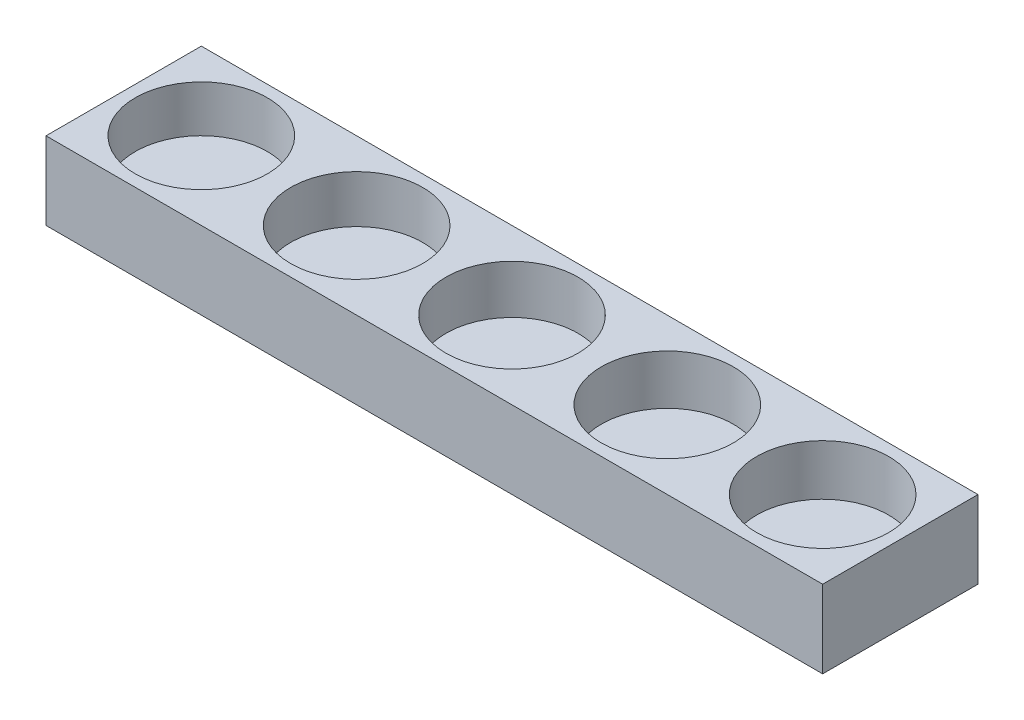
ISO-10303-21;
HEADER;
FILE_DESCRIPTION(('STEP AP214'),'2;1');
FILE_NAME('part.step','',(''),(''),'','','');
FILE_SCHEMA(('AUTOMOTIVE_DESIGN { 1 0 10303 214 1 1 1 1 }'));
ENDSEC;
DATA;
#1=APPLICATION_CONTEXT('core data for automotive mechanical design processes');
#2=APPLICATION_PROTOCOL_DEFINITION('international standard','automotive_design',2000,#1);
#3=PRODUCT_CONTEXT('',#1,'mechanical');
#4=PRODUCT('Part','Part','',(#3));
#5=PRODUCT_RELATED_PRODUCT_CATEGORY('part','',(#4));
#6=PRODUCT_DEFINITION_FORMATION('','',#4);
#7=PRODUCT_DEFINITION_CONTEXT('part definition',#1,'design');
#8=PRODUCT_DEFINITION('design','',#6,#7);
#9=PRODUCT_DEFINITION_SHAPE('','',#8);
#10=(LENGTH_UNIT() NAMED_UNIT(*) SI_UNIT(.MILLI.,.METRE.));
#11=(NAMED_UNIT(*) PLANE_ANGLE_UNIT() SI_UNIT($,.RADIAN.));
#12=(NAMED_UNIT(*) SI_UNIT($,.STERADIAN.) SOLID_ANGLE_UNIT());
#13=UNCERTAINTY_MEASURE_WITH_UNIT(LENGTH_MEASURE(1.E-05),#10,'distance_accuracy_value','');
#14=(GEOMETRIC_REPRESENTATION_CONTEXT(3) GLOBAL_UNCERTAINTY_ASSIGNED_CONTEXT((#13)) GLOBAL_UNIT_ASSIGNED_CONTEXT((#10,
#11,#12)) REPRESENTATION_CONTEXT('',''));
#15=CARTESIAN_POINT('',(0.,0.,0.));
#16=DIRECTION('',(0.,0.,1.));
#17=DIRECTION('',(1.,0.,0.));
#18=AXIS2_PLACEMENT_3D('',#15,#16,#17);
#19=CARTESIAN_POINT('',(0.,0.,0.));
#20=DIRECTION('',(0.,1.,0.));
#21=DIRECTION('',(0.,0.,1.));
#22=AXIS2_PLACEMENT_3D('',#19,#20,#21);
#23=PLANE('',#22);
#24=DIRECTION('',(0.,0.,1.));
#25=VECTOR('',#24,1.);
#26=CARTESIAN_POINT('',(-75.,0.,15.));
#27=LINE('',#26,#25);
#28=CARTESIAN_POINT('',(-75.,0.,-15.));
#29=VERTEX_POINT('',#28);
#30=CARTESIAN_POINT('',(-75.,0.,15.));
#31=VERTEX_POINT('',#30);
#32=EDGE_CURVE('E85',#29,#31,#27,.T.);
#33=ORIENTED_EDGE('',*,*,#32,.F.);
#34=DIRECTION('',(-1.,0.,0.));
#35=VECTOR('',#34,1.);
#36=CARTESIAN_POINT('',(75.,0.,-15.));
#37=LINE('',#36,#35);
#38=CARTESIAN_POINT('',(75.,0.,-15.));
#39=VERTEX_POINT('',#38);
#40=EDGE_CURVE('E54',#39,#29,#37,.T.);
#41=ORIENTED_EDGE('',*,*,#40,.F.);
#42=DIRECTION('',(0.,0.,-1.));
#43=VECTOR('',#42,1.);
#44=CARTESIAN_POINT('',(75.,0.,15.));
#45=LINE('',#44,#43);
#46=CARTESIAN_POINT('',(75.,0.,15.));
#47=VERTEX_POINT('',#46);
#48=EDGE_CURVE('E62',#47,#39,#45,.T.);
#49=ORIENTED_EDGE('',*,*,#48,.F.);
#50=DIRECTION('',(1.,0.,0.));
#51=VECTOR('',#50,1.);
#52=CARTESIAN_POINT('',(75.,0.,15.));
#53=LINE('',#52,#51);
#54=EDGE_CURVE('E139',#31,#47,#53,.T.);
#55=ORIENTED_EDGE('',*,*,#54,.F.);
#56=EDGE_LOOP('',(#33,#41,#49,#55));
#57=FACE_BOUND('',#56,.T.);
#58=CARTESIAN_POINT('',(-60.,0.,0.));
#59=DIRECTION('',(0.,1.,0.));
#60=DIRECTION('',(0.,0.,1.));
#61=AXIS2_PLACEMENT_3D('',#58,#59,#60);
#62=CIRCLE('',#61,5.);
#63=CARTESIAN_POINT('',(-60.,0.,5.00000000000001));
#64=VERTEX_POINT('',#63);
#65=EDGE_CURVE('E133',#64,#64,#62,.T.);
#66=ORIENTED_EDGE('',*,*,#65,.T.);
#67=EDGE_LOOP('',(#66));
#68=FACE_BOUND('',#67,.T.);
#69=CARTESIAN_POINT('',(-30.,0.,0.));
#70=DIRECTION('',(0.,1.,0.));
#71=DIRECTION('',(0.,0.,1.));
#72=AXIS2_PLACEMENT_3D('',#69,#70,#71);
#73=CIRCLE('',#72,5.);
#74=CARTESIAN_POINT('',(-30.,0.,5.00000000000001));
#75=VERTEX_POINT('',#74);
#76=EDGE_CURVE('E128',#75,#75,#73,.T.);
#77=ORIENTED_EDGE('',*,*,#76,.T.);
#78=EDGE_LOOP('',(#77));
#79=FACE_BOUND('',#78,.T.);
#80=CARTESIAN_POINT('',(0.,0.,0.));
#81=DIRECTION('',(0.,1.,0.));
#82=DIRECTION('',(0.,0.,1.));
#83=AXIS2_PLACEMENT_3D('',#80,#81,#82);
#84=CIRCLE('',#83,5.);
#85=CARTESIAN_POINT('',(0.,0.,5.00000000000001));
#86=VERTEX_POINT('',#85);
#87=EDGE_CURVE('E122',#86,#86,#84,.T.);
#88=ORIENTED_EDGE('',*,*,#87,.T.);
#89=EDGE_LOOP('',(#88));
#90=FACE_BOUND('',#89,.T.);
#91=CARTESIAN_POINT('',(30.,0.,0.));
#92=DIRECTION('',(0.,1.,0.));
#93=DIRECTION('',(0.,0.,1.));
#94=AXIS2_PLACEMENT_3D('',#91,#92,#93);
#95=CIRCLE('',#94,5.);
#96=CARTESIAN_POINT('',(30.,0.,5.00000000000001));
#97=VERTEX_POINT('',#96);
#98=EDGE_CURVE('E115',#97,#97,#95,.T.);
#99=ORIENTED_EDGE('',*,*,#98,.T.);
#100=EDGE_LOOP('',(#99));
#101=FACE_BOUND('',#100,.T.);
#102=CARTESIAN_POINT('',(60.,0.,0.));
#103=DIRECTION('',(0.,1.,0.));
#104=DIRECTION('',(0.,0.,1.));
#105=AXIS2_PLACEMENT_3D('',#102,#103,#104);
#106=CIRCLE('',#105,4.99999999999999);
#107=CARTESIAN_POINT('',(60.,0.,5.));
#108=VERTEX_POINT('',#107);
#109=EDGE_CURVE('E112',#108,#108,#106,.T.);
#110=ORIENTED_EDGE('',*,*,#109,.T.);
#111=EDGE_LOOP('',(#110));
#112=FACE_BOUND('',#111,.T.);
#113=ADVANCED_FACE('F39',(#57,#68,#79,#90,#101,#112),#23,.F.);
#114=CARTESIAN_POINT('',(-75.,5.,15.));
#115=DIRECTION('',(1.,0.,0.));
#116=DIRECTION('',(0.,0.,-1.));
#117=AXIS2_PLACEMENT_3D('',#114,#115,#116);
#118=PLANE('',#117);
#119=ORIENTED_EDGE('',*,*,#32,.T.);
#120=DIRECTION('',(0.,-1.,0.));
#121=VECTOR('',#120,1.);
#122=CARTESIAN_POINT('',(-75.,5.,15.));
#123=LINE('',#122,#121);
#124=CARTESIAN_POINT('',(-75.,15.,15.));
#125=VERTEX_POINT('',#124);
#126=EDGE_CURVE('E12',#125,#31,#123,.T.);
#127=ORIENTED_EDGE('',*,*,#126,.F.);
#128=DIRECTION('',(0.,0.,1.));
#129=VECTOR('',#128,1.);
#130=CARTESIAN_POINT('',(-75.,15.,-15.));
#131=LINE('',#130,#129);
#132=CARTESIAN_POINT('',(-75.,15.,-15.));
#133=VERTEX_POINT('',#132);
#134=EDGE_CURVE('E83',#133,#125,#131,.T.);
#135=ORIENTED_EDGE('',*,*,#134,.F.);
#136=DIRECTION('',(0.,-1.,0.));
#137=VECTOR('',#136,1.);
#138=CARTESIAN_POINT('',(-75.,5.,-15.));
#139=LINE('',#138,#137);
#140=EDGE_CURVE('E143',#133,#29,#139,.T.);
#141=ORIENTED_EDGE('',*,*,#140,.T.);
#142=EDGE_LOOP('',(#119,#127,#135,#141));
#143=FACE_BOUND('',#142,.T.);
#144=ADVANCED_FACE('F41',(#143),#118,.F.);
#145=CARTESIAN_POINT('',(75.,5.,15.));
#146=DIRECTION('',(0.,0.,-1.));
#147=DIRECTION('',(-1.,0.,0.));
#148=AXIS2_PLACEMENT_3D('',#145,#146,#147);
#149=PLANE('',#148);
#150=ORIENTED_EDGE('',*,*,#54,.T.);
#151=DIRECTION('',(0.,-1.,0.));
#152=VECTOR('',#151,1.);
#153=CARTESIAN_POINT('',(75.,5.,15.));
#154=LINE('',#153,#152);
#155=CARTESIAN_POINT('',(75.,15.,15.));
#156=VERTEX_POINT('',#155);
#157=EDGE_CURVE('E47',#156,#47,#154,.T.);
#158=ORIENTED_EDGE('',*,*,#157,.F.);
#159=DIRECTION('',(1.,0.,0.));
#160=VECTOR('',#159,1.);
#161=CARTESIAN_POINT('',(-75.,15.,15.));
#162=LINE('',#161,#160);
#163=EDGE_CURVE('E88',#125,#156,#162,.T.);
#164=ORIENTED_EDGE('',*,*,#163,.F.);
#165=ORIENTED_EDGE('',*,*,#126,.T.);
#166=EDGE_LOOP('',(#150,#158,#164,#165));
#167=FACE_BOUND('',#166,.T.);
#168=ADVANCED_FACE('F89',(#167),#149,.F.);
#169=CARTESIAN_POINT('',(75.,5.,15.));
#170=DIRECTION('',(-1.,0.,0.));
#171=DIRECTION('',(0.,0.,1.));
#172=AXIS2_PLACEMENT_3D('',#169,#170,#171);
#173=PLANE('',#172);
#174=ORIENTED_EDGE('',*,*,#48,.T.);
#175=DIRECTION('',(0.,-1.,0.));
#176=VECTOR('',#175,1.);
#177=CARTESIAN_POINT('',(75.,5.,-15.));
#178=LINE('',#177,#176);
#179=CARTESIAN_POINT('',(75.,15.,-15.));
#180=VERTEX_POINT('',#179);
#181=EDGE_CURVE('E145',#180,#39,#178,.T.);
#182=ORIENTED_EDGE('',*,*,#181,.F.);
#183=DIRECTION('',(0.,0.,-1.));
#184=VECTOR('',#183,1.);
#185=CARTESIAN_POINT('',(75.,15.,-15.));
#186=LINE('',#185,#184);
#187=EDGE_CURVE('E93',#156,#180,#186,.T.);
#188=ORIENTED_EDGE('',*,*,#187,.F.);
#189=ORIENTED_EDGE('',*,*,#157,.T.);
#190=EDGE_LOOP('',(#174,#182,#188,#189));
#191=FACE_BOUND('',#190,.T.);
#192=ADVANCED_FACE('F146',(#191),#173,.F.);
#193=CARTESIAN_POINT('',(75.,5.,-15.));
#194=DIRECTION('',(0.,0.,1.));
#195=DIRECTION('',(1.,0.,0.));
#196=AXIS2_PLACEMENT_3D('',#193,#194,#195);
#197=PLANE('',#196);
#198=ORIENTED_EDGE('',*,*,#40,.T.);
#199=ORIENTED_EDGE('',*,*,#140,.F.);
#200=DIRECTION('',(-1.,0.,0.));
#201=VECTOR('',#200,1.);
#202=CARTESIAN_POINT('',(-75.,15.,-15.));
#203=LINE('',#202,#201);
#204=EDGE_CURVE('E98',#180,#133,#203,.T.);
#205=ORIENTED_EDGE('',*,*,#204,.F.);
#206=ORIENTED_EDGE('',*,*,#181,.T.);
#207=EDGE_LOOP('',(#198,#199,#205,#206));
#208=FACE_BOUND('',#207,.T.);
#209=ADVANCED_FACE('F189',(#208),#197,.F.);
#210=CARTESIAN_POINT('',(-60.,5.,0.));
#211=DIRECTION('',(0.,-1.,0.));
#212=DIRECTION('',(0.,0.,-1.));
#213=AXIS2_PLACEMENT_3D('',#210,#211,#212);
#214=CYLINDRICAL_SURFACE('',#213,5.);
#215=CARTESIAN_POINT('',(-60.,5.,0.));
#216=DIRECTION('',(0.,1.,0.));
#217=DIRECTION('',(0.,0.,1.));
#218=AXIS2_PLACEMENT_3D('',#215,#216,#217);
#219=CIRCLE('',#218,5.);
#220=CARTESIAN_POINT('',(-60.,5.,5.00000000000001));
#221=VERTEX_POINT('',#220);
#222=EDGE_CURVE('E125',#221,#221,#219,.T.);
#223=ORIENTED_EDGE('',*,*,#222,.T.);
#224=EDGE_LOOP('',(#223));
#225=FACE_BOUND('',#224,.T.);
#226=ORIENTED_EDGE('',*,*,#65,.F.);
#227=EDGE_LOOP('',(#226));
#228=FACE_BOUND('',#227,.T.);
#229=ADVANCED_FACE('F186',(#225,#228),#214,.F.);
#230=CARTESIAN_POINT('',(-30.,5.,0.));
#231=DIRECTION('',(0.,-1.,0.));
#232=DIRECTION('',(0.,0.,-1.));
#233=AXIS2_PLACEMENT_3D('',#230,#231,#232);
#234=CYLINDRICAL_SURFACE('',#233,5.);
#235=CARTESIAN_POINT('',(-30.,5.,0.));
#236=DIRECTION('',(0.,1.,0.));
#237=DIRECTION('',(0.,0.,1.));
#238=AXIS2_PLACEMENT_3D('',#235,#236,#237);
#239=CIRCLE('',#238,5.);
#240=CARTESIAN_POINT('',(-30.,5.,5.00000000000001));
#241=VERTEX_POINT('',#240);
#242=EDGE_CURVE('E119',#241,#241,#239,.T.);
#243=ORIENTED_EDGE('',*,*,#242,.T.);
#244=EDGE_LOOP('',(#243));
#245=FACE_BOUND('',#244,.T.);
#246=ORIENTED_EDGE('',*,*,#76,.F.);
#247=EDGE_LOOP('',(#246));
#248=FACE_BOUND('',#247,.T.);
#249=ADVANCED_FACE('F182',(#245,#248),#234,.F.);
#250=CARTESIAN_POINT('',(0.,5.,0.));
#251=DIRECTION('',(0.,-1.,0.));
#252=DIRECTION('',(0.,0.,-1.));
#253=AXIS2_PLACEMENT_3D('',#250,#251,#252);
#254=CYLINDRICAL_SURFACE('',#253,5.);
#255=CARTESIAN_POINT('',(0.,5.,0.));
#256=DIRECTION('',(0.,1.,0.));
#257=DIRECTION('',(0.,0.,1.));
#258=AXIS2_PLACEMENT_3D('',#255,#256,#257);
#259=CIRCLE('',#258,5.);
#260=CARTESIAN_POINT('',(0.,5.,5.00000000000001));
#261=VERTEX_POINT('',#260);
#262=EDGE_CURVE('E111',#261,#261,#259,.T.);
#263=ORIENTED_EDGE('',*,*,#262,.T.);
#264=EDGE_LOOP('',(#263));
#265=FACE_BOUND('',#264,.T.);
#266=ORIENTED_EDGE('',*,*,#87,.F.);
#267=EDGE_LOOP('',(#266));
#268=FACE_BOUND('',#267,.T.);
#269=ADVANCED_FACE('F175',(#265,#268),#254,.F.);
#270=CARTESIAN_POINT('',(30.,5.,0.));
#271=DIRECTION('',(0.,-1.,0.));
#272=DIRECTION('',(0.,0.,-1.));
#273=AXIS2_PLACEMENT_3D('',#270,#271,#272);
#274=CYLINDRICAL_SURFACE('',#273,5.);
#275=CARTESIAN_POINT('',(30.,5.,0.));
#276=DIRECTION('',(0.,1.,0.));
#277=DIRECTION('',(0.,0.,1.));
#278=AXIS2_PLACEMENT_3D('',#275,#276,#277);
#279=CIRCLE('',#278,5.);
#280=CARTESIAN_POINT('',(30.,5.,5.00000000000001));
#281=VERTEX_POINT('',#280);
#282=EDGE_CURVE('E116',#281,#281,#279,.T.);
#283=ORIENTED_EDGE('',*,*,#282,.T.);
#284=EDGE_LOOP('',(#283));
#285=FACE_BOUND('',#284,.T.);
#286=ORIENTED_EDGE('',*,*,#98,.F.);
#287=EDGE_LOOP('',(#286));
#288=FACE_BOUND('',#287,.T.);
#289=ADVANCED_FACE('F164',(#285,#288),#274,.F.);
#290=CARTESIAN_POINT('',(60.,5.,0.));
#291=DIRECTION('',(0.,-1.,0.));
#292=DIRECTION('',(0.,0.,-1.));
#293=AXIS2_PLACEMENT_3D('',#290,#291,#292);
#294=CYLINDRICAL_SURFACE('',#293,4.99999999999999);
#295=CARTESIAN_POINT('',(60.,5.,0.));
#296=DIRECTION('',(0.,1.,0.));
#297=DIRECTION('',(0.,0.,1.));
#298=AXIS2_PLACEMENT_3D('',#295,#296,#297);
#299=CIRCLE('',#298,4.99999999999999);
#300=CARTESIAN_POINT('',(60.,5.,5.));
#301=VERTEX_POINT('',#300);
#302=EDGE_CURVE('E108',#301,#301,#299,.T.);
#303=ORIENTED_EDGE('',*,*,#302,.T.);
#304=EDGE_LOOP('',(#303));
#305=FACE_BOUND('',#304,.T.);
#306=ORIENTED_EDGE('',*,*,#109,.F.);
#307=EDGE_LOOP('',(#306));
#308=FACE_BOUND('',#307,.T.);
#309=ADVANCED_FACE('F161',(#305,#308),#294,.F.);
#310=CARTESIAN_POINT('',(0.,5.,0.));
#311=DIRECTION('',(0.,1.,0.));
#312=DIRECTION('',(0.,0.,1.));
#313=AXIS2_PLACEMENT_3D('',#310,#311,#312);
#314=PLANE('',#313);
#315=ORIENTED_EDGE('',*,*,#302,.F.);
#316=EDGE_LOOP('',(#315));
#317=FACE_BOUND('',#316,.T.);
#318=ADVANCED_FACE('F163',(#317),#314,.F.);
#319=ORIENTED_EDGE('',*,*,#262,.F.);
#320=EDGE_LOOP('',(#319));
#321=FACE_BOUND('',#320,.T.);
#322=ADVANCED_FACE('F171',(#321),#314,.F.);
#323=ORIENTED_EDGE('',*,*,#222,.F.);
#324=EDGE_LOOP('',(#323));
#325=FACE_BOUND('',#324,.T.);
#326=ADVANCED_FACE('F290',(#325),#314,.F.);
#327=ORIENTED_EDGE('',*,*,#242,.F.);
#328=EDGE_LOOP('',(#327));
#329=FACE_BOUND('',#328,.T.);
#330=ADVANCED_FACE('F300',(#329),#314,.F.);
#331=ORIENTED_EDGE('',*,*,#282,.F.);
#332=EDGE_LOOP('',(#331));
#333=FACE_BOUND('',#332,.T.);
#334=ADVANCED_FACE('F174',(#333),#314,.F.);
#335=CARTESIAN_POINT('',(0.,15.,0.));
#336=DIRECTION('',(0.,1.,0.));
#337=DIRECTION('',(0.,0.,1.));
#338=AXIS2_PLACEMENT_3D('',#335,#336,#337);
#339=PLANE('',#338);
#340=CARTESIAN_POINT('',(60.,15.,0.));
#341=DIRECTION('',(0.,1.,0.));
#342=DIRECTION('',(0.,0.,1.));
#343=AXIS2_PLACEMENT_3D('',#340,#341,#342);
#344=CIRCLE('',#343,12.75);
#345=CARTESIAN_POINT('',(60.,15.,12.75));
#346=VERTEX_POINT('',#345);
#347=EDGE_CURVE('E460',#346,#346,#344,.T.);
#348=ORIENTED_EDGE('',*,*,#347,.F.);
#349=EDGE_LOOP('',(#348));
#350=FACE_BOUND('',#349,.T.);
#351=CARTESIAN_POINT('',(30.,15.,0.));
#352=DIRECTION('',(0.,1.,0.));
#353=DIRECTION('',(0.,0.,1.));
#354=AXIS2_PLACEMENT_3D('',#351,#352,#353);
#355=CIRCLE('',#354,12.75);
#356=CARTESIAN_POINT('',(30.,15.,12.75));
#357=VERTEX_POINT('',#356);
#358=EDGE_CURVE('E459',#357,#357,#355,.T.);
#359=ORIENTED_EDGE('',*,*,#358,.F.);
#360=EDGE_LOOP('',(#359));
#361=FACE_BOUND('',#360,.T.);
#362=CARTESIAN_POINT('',(0.,15.,0.));
#363=DIRECTION('',(0.,1.,0.));
#364=DIRECTION('',(0.,0.,1.));
#365=AXIS2_PLACEMENT_3D('',#362,#363,#364);
#366=CIRCLE('',#365,12.75);
#367=CARTESIAN_POINT('',(0.,15.,12.75));
#368=VERTEX_POINT('',#367);
#369=EDGE_CURVE('E470',#368,#368,#366,.T.);
#370=ORIENTED_EDGE('',*,*,#369,.F.);
#371=EDGE_LOOP('',(#370));
#372=FACE_BOUND('',#371,.T.);
#373=CARTESIAN_POINT('',(-30.,15.,0.));
#374=DIRECTION('',(0.,1.,0.));
#375=DIRECTION('',(0.,0.,1.));
#376=AXIS2_PLACEMENT_3D('',#373,#374,#375);
#377=CIRCLE('',#376,12.75);
#378=CARTESIAN_POINT('',(-30.,15.,12.75));
#379=VERTEX_POINT('',#378);
#380=EDGE_CURVE('E476',#379,#379,#377,.T.);
#381=ORIENTED_EDGE('',*,*,#380,.F.);
#382=EDGE_LOOP('',(#381));
#383=FACE_BOUND('',#382,.T.);
#384=CARTESIAN_POINT('',(-60.,15.,0.));
#385=DIRECTION('',(0.,1.,0.));
#386=DIRECTION('',(0.,0.,1.));
#387=AXIS2_PLACEMENT_3D('',#384,#385,#386);
#388=CIRCLE('',#387,12.75);
#389=CARTESIAN_POINT('',(-60.,15.,12.75));
#390=VERTEX_POINT('',#389);
#391=EDGE_CURVE('E102',#390,#390,#388,.T.);
#392=ORIENTED_EDGE('',*,*,#391,.F.);
#393=EDGE_LOOP('',(#392));
#394=FACE_BOUND('',#393,.T.);
#395=ORIENTED_EDGE('',*,*,#134,.T.);
#396=ORIENTED_EDGE('',*,*,#163,.T.);
#397=ORIENTED_EDGE('',*,*,#187,.T.);
#398=ORIENTED_EDGE('',*,*,#204,.T.);
#399=EDGE_LOOP('',(#395,#396,#397,#398));
#400=FACE_BOUND('',#399,.T.);
#401=ADVANCED_FACE('F96',(#350,#361,#372,#383,#394,#400),#339,.T.);
#402=CARTESIAN_POINT('',(-60.,-31.0624458405139,0.));
#403=DIRECTION('',(0.,1.,0.));
#404=DIRECTION('',(0.,0.,1.));
#405=AXIS2_PLACEMENT_3D('',#402,#403,#404);
#406=CYLINDRICAL_SURFACE('',#405,12.75);
#407=CARTESIAN_POINT('',(-60.,6.,0.));
#408=DIRECTION('',(0.,1.,0.));
#409=DIRECTION('',(0.,0.,1.));
#410=AXIS2_PLACEMENT_3D('',#407,#408,#409);
#411=CIRCLE('',#410,12.75);
#412=CARTESIAN_POINT('',(-60.,6.,12.75));
#413=VERTEX_POINT('',#412);
#414=EDGE_CURVE('E99',#413,#413,#411,.F.);
#415=ORIENTED_EDGE('',*,*,#414,.T.);
#416=EDGE_LOOP('',(#415));
#417=FACE_BOUND('',#416,.T.);
#418=ORIENTED_EDGE('',*,*,#391,.T.);
#419=EDGE_LOOP('',(#418));
#420=FACE_BOUND('',#419,.T.);
#421=ADVANCED_FACE('F329',(#417,#420),#406,.F.);
#422=CARTESIAN_POINT('',(0.,6.,0.));
#423=DIRECTION('',(0.,1.,0.));
#424=DIRECTION('',(0.,0.,1.));
#425=AXIS2_PLACEMENT_3D('',#422,#423,#424);
#426=PLANE('',#425);
#427=ORIENTED_EDGE('',*,*,#414,.F.);
#428=EDGE_LOOP('',(#427));
#429=FACE_BOUND('',#428,.T.);
#430=ADVANCED_FACE('F340',(#429),#426,.T.);
#431=CARTESIAN_POINT('',(-30.,-31.0624458405139,0.));
#432=DIRECTION('',(0.,1.,0.));
#433=DIRECTION('',(0.,0.,1.));
#434=AXIS2_PLACEMENT_3D('',#431,#432,#433);
#435=CYLINDRICAL_SURFACE('',#434,12.75);
#436=CARTESIAN_POINT('',(-30.,5.8,0.));
#437=DIRECTION('',(0.,1.,0.));
#438=DIRECTION('',(0.,0.,1.));
#439=AXIS2_PLACEMENT_3D('',#436,#437,#438);
#440=CIRCLE('',#439,12.75);
#441=CARTESIAN_POINT('',(-30.,5.8,12.75));
#442=VERTEX_POINT('',#441);
#443=EDGE_CURVE('E479',#442,#442,#440,.F.);
#444=ORIENTED_EDGE('',*,*,#443,.T.);
#445=EDGE_LOOP('',(#444));
#446=FACE_BOUND('',#445,.T.);
#447=ORIENTED_EDGE('',*,*,#380,.T.);
#448=EDGE_LOOP('',(#447));
#449=FACE_BOUND('',#448,.T.);
#450=ADVANCED_FACE('F351',(#446,#449),#435,.F.);
#451=CARTESIAN_POINT('',(0.,5.8,0.));
#452=DIRECTION('',(0.,1.,0.));
#453=DIRECTION('',(0.,0.,1.));
#454=AXIS2_PLACEMENT_3D('',#451,#452,#453);
#455=PLANE('',#454);
#456=ORIENTED_EDGE('',*,*,#443,.F.);
#457=EDGE_LOOP('',(#456));
#458=FACE_BOUND('',#457,.T.);
#459=ADVANCED_FACE('F362',(#458),#455,.T.);
#460=CARTESIAN_POINT('',(0.,-31.0624458405139,0.));
#461=DIRECTION('',(0.,1.,0.));
#462=DIRECTION('',(0.,0.,1.));
#463=AXIS2_PLACEMENT_3D('',#460,#461,#462);
#464=CYLINDRICAL_SURFACE('',#463,12.75);
#465=CARTESIAN_POINT('',(0.,5.6,0.));
#466=DIRECTION('',(0.,1.,0.));
#467=DIRECTION('',(0.,0.,1.));
#468=AXIS2_PLACEMENT_3D('',#465,#466,#467);
#469=CIRCLE('',#468,12.75);
#470=CARTESIAN_POINT('',(0.,5.6,12.75));
#471=VERTEX_POINT('',#470);
#472=EDGE_CURVE('E473',#471,#471,#469,.F.);
#473=ORIENTED_EDGE('',*,*,#472,.T.);
#474=EDGE_LOOP('',(#473));
#475=FACE_BOUND('',#474,.T.);
#476=ORIENTED_EDGE('',*,*,#369,.T.);
#477=EDGE_LOOP('',(#476));
#478=FACE_BOUND('',#477,.T.);
#479=ADVANCED_FACE('F373',(#475,#478),#464,.F.);
#480=CARTESIAN_POINT('',(0.,5.6,0.));
#481=DIRECTION('',(0.,1.,0.));
#482=DIRECTION('',(0.,0.,1.));
#483=AXIS2_PLACEMENT_3D('',#480,#481,#482);
#484=PLANE('',#483);
#485=ORIENTED_EDGE('',*,*,#472,.F.);
#486=EDGE_LOOP('',(#485));
#487=FACE_BOUND('',#486,.T.);
#488=ADVANCED_FACE('F384',(#487),#484,.T.);
#489=CARTESIAN_POINT('',(30.,-31.0624458405139,0.));
#490=DIRECTION('',(0.,1.,0.));
#491=DIRECTION('',(0.,0.,1.));
#492=AXIS2_PLACEMENT_3D('',#489,#490,#491);
#493=CYLINDRICAL_SURFACE('',#492,12.75);
#494=CARTESIAN_POINT('',(30.,5.4,0.));
#495=DIRECTION('',(0.,1.,0.));
#496=DIRECTION('',(0.,0.,1.));
#497=AXIS2_PLACEMENT_3D('',#494,#495,#496);
#498=CIRCLE('',#497,12.75);
#499=CARTESIAN_POINT('',(30.,5.4,12.75));
#500=VERTEX_POINT('',#499);
#501=EDGE_CURVE('E463',#500,#500,#498,.F.);
#502=ORIENTED_EDGE('',*,*,#501,.T.);
#503=EDGE_LOOP('',(#502));
#504=FACE_BOUND('',#503,.T.);
#505=ORIENTED_EDGE('',*,*,#358,.T.);
#506=EDGE_LOOP('',(#505));
#507=FACE_BOUND('',#506,.T.);
#508=ADVANCED_FACE('F395',(#504,#507),#493,.F.);
#509=CARTESIAN_POINT('',(0.,5.4,0.));
#510=DIRECTION('',(0.,1.,0.));
#511=DIRECTION('',(0.,0.,1.));
#512=AXIS2_PLACEMENT_3D('',#509,#510,#511);
#513=PLANE('',#512);
#514=ORIENTED_EDGE('',*,*,#501,.F.);
#515=EDGE_LOOP('',(#514));
#516=FACE_BOUND('',#515,.T.);
#517=ADVANCED_FACE('F406',(#516),#513,.T.);
#518=CARTESIAN_POINT('',(60.,-31.0624458405139,0.));
#519=DIRECTION('',(0.,1.,0.));
#520=DIRECTION('',(0.,0.,1.));
#521=AXIS2_PLACEMENT_3D('',#518,#519,#520);
#522=CYLINDRICAL_SURFACE('',#521,12.75);
#523=CARTESIAN_POINT('',(60.,5.2,0.));
#524=DIRECTION('',(0.,1.,0.));
#525=DIRECTION('',(0.,0.,1.));
#526=AXIS2_PLACEMENT_3D('',#523,#524,#525);
#527=CIRCLE('',#526,12.75);
#528=CARTESIAN_POINT('',(60.,5.2,12.75));
#529=VERTEX_POINT('',#528);
#530=EDGE_CURVE('E458',#529,#529,#527,.F.);
#531=ORIENTED_EDGE('',*,*,#530,.T.);
#532=EDGE_LOOP('',(#531));
#533=FACE_BOUND('',#532,.T.);
#534=ORIENTED_EDGE('',*,*,#347,.T.);
#535=EDGE_LOOP('',(#534));
#536=FACE_BOUND('',#535,.T.);
#537=ADVANCED_FACE('F416',(#533,#536),#522,.F.);
#538=CARTESIAN_POINT('',(0.,5.2,0.));
#539=DIRECTION('',(0.,1.,0.));
#540=DIRECTION('',(0.,0.,1.));
#541=AXIS2_PLACEMENT_3D('',#538,#539,#540);
#542=PLANE('',#541);
#543=ORIENTED_EDGE('',*,*,#530,.F.);
#544=EDGE_LOOP('',(#543));
#545=FACE_BOUND('',#544,.T.);
#546=ADVANCED_FACE('F426',(#545),#542,.T.);
#547=CLOSED_SHELL('',(#113,#144,#168,#192,#209,#229,#249,#269,#289,#309,#318,#322,#326,#330,
#334,#401,#421,#430,#450,#459,#479,#488,#508,#517,#537,#546));
#548=MANIFOLD_SOLID_BREP('B2',#547);
#549=ADVANCED_BREP_SHAPE_REPRESENTATION('',(#18,#548),#14);
#550=SHAPE_DEFINITION_REPRESENTATION(#9,#549);
ENDSEC;
END-ISO-10303-21;
